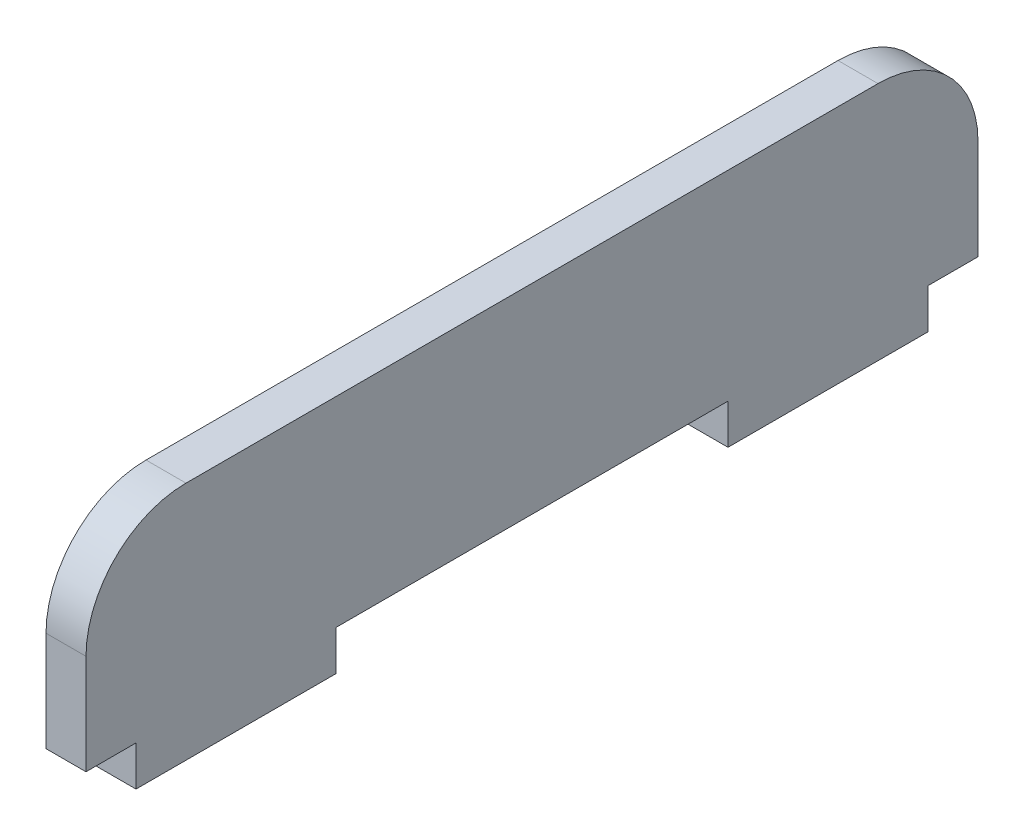
ISO-10303-21;
HEADER;
FILE_DESCRIPTION(('STEP AP214'),'2;1');
FILE_NAME('part.step','',(''),(''),'','','');
FILE_SCHEMA(('AUTOMOTIVE_DESIGN { 1 0 10303 214 1 1 1 1 }'));
ENDSEC;
DATA;
#1=APPLICATION_CONTEXT('core data for automotive mechanical design processes');
#2=APPLICATION_PROTOCOL_DEFINITION('international standard','automotive_design',2000,#1);
#3=PRODUCT_CONTEXT('',#1,'mechanical');
#4=PRODUCT('Part','Part','',(#3));
#5=PRODUCT_RELATED_PRODUCT_CATEGORY('part','',(#4));
#6=PRODUCT_DEFINITION_FORMATION('','',#4);
#7=PRODUCT_DEFINITION_CONTEXT('part definition',#1,'design');
#8=PRODUCT_DEFINITION('design','',#6,#7);
#9=PRODUCT_DEFINITION_SHAPE('','',#8);
#10=(LENGTH_UNIT() NAMED_UNIT(*) SI_UNIT(.MILLI.,.METRE.));
#11=(NAMED_UNIT(*) PLANE_ANGLE_UNIT() SI_UNIT($,.RADIAN.));
#12=(NAMED_UNIT(*) SI_UNIT($,.STERADIAN.) SOLID_ANGLE_UNIT());
#13=UNCERTAINTY_MEASURE_WITH_UNIT(LENGTH_MEASURE(1.E-05),#10,'distance_accuracy_value','');
#14=(GEOMETRIC_REPRESENTATION_CONTEXT(3) GLOBAL_UNCERTAINTY_ASSIGNED_CONTEXT((#13)) GLOBAL_UNIT_ASSIGNED_CONTEXT((#10,
#11,#12)) REPRESENTATION_CONTEXT('',''));
#15=CARTESIAN_POINT('',(0.,0.,0.));
#16=DIRECTION('',(0.,0.,1.));
#17=DIRECTION('',(1.,0.,0.));
#18=AXIS2_PLACEMENT_3D('',#15,#16,#17);
#19=CARTESIAN_POINT('',(164.,4.,-97.1));
#20=DIRECTION('',(0.,1.,0.));
#21=DIRECTION('',(0.,0.,1.));
#22=AXIS2_PLACEMENT_3D('',#19,#20,#21);
#23=PLANE('',#22);
#24=DIRECTION('',(0.,0.,-1.));
#25=VECTOR('',#24,1.);
#26=CARTESIAN_POINT('',(160.,4.,-97.1));
#27=LINE('',#26,#25);
#28=CARTESIAN_POINT('',(160.,4.,-92.1));
#29=VERTEX_POINT('',#28);
#30=CARTESIAN_POINT('',(160.,4.,-97.1));
#31=VERTEX_POINT('',#30);
#32=EDGE_CURVE('E162',#29,#31,#27,.T.);
#33=ORIENTED_EDGE('',*,*,#32,.T.);
#34=DIRECTION('',(-1.,0.,0.));
#35=VECTOR('',#34,1.);
#36=CARTESIAN_POINT('',(164.,4.,-97.1));
#37=LINE('',#36,#35);
#38=CARTESIAN_POINT('',(164.,4.,-97.1));
#39=VERTEX_POINT('',#38);
#40=EDGE_CURVE('E11',#39,#31,#37,.T.);
#41=ORIENTED_EDGE('',*,*,#40,.F.);
#42=DIRECTION('',(0.,0.,-1.));
#43=VECTOR('',#42,1.);
#44=CARTESIAN_POINT('',(164.,4.,-97.1));
#45=LINE('',#44,#43);
#46=CARTESIAN_POINT('',(164.,4.,-92.1));
#47=VERTEX_POINT('',#46);
#48=EDGE_CURVE('E189',#47,#39,#45,.T.);
#49=ORIENTED_EDGE('',*,*,#48,.F.);
#50=DIRECTION('',(-1.,0.,0.));
#51=VECTOR('',#50,1.);
#52=CARTESIAN_POINT('',(164.,4.,-92.1));
#53=LINE('',#52,#51);
#54=EDGE_CURVE('E158',#47,#29,#53,.T.);
#55=ORIENTED_EDGE('',*,*,#54,.T.);
#56=EDGE_LOOP('',(#33,#41,#49,#55));
#57=FACE_BOUND('',#56,.T.);
#58=ADVANCED_FACE('F30',(#57),#23,.F.);
#59=CARTESIAN_POINT('',(164.,14.,-97.1));
#60=DIRECTION('',(0.,0.,1.));
#61=DIRECTION('',(1.,0.,0.));
#62=AXIS2_PLACEMENT_3D('',#59,#60,#61);
#63=PLANE('',#62);
#64=DIRECTION('',(0.,1.,0.));
#65=VECTOR('',#64,1.);
#66=CARTESIAN_POINT('',(160.,14.,-97.1));
#67=LINE('',#66,#65);
#68=CARTESIAN_POINT('',(160.,14.,-97.1));
#69=VERTEX_POINT('',#68);
#70=EDGE_CURVE('E165',#31,#69,#67,.T.);
#71=ORIENTED_EDGE('',*,*,#70,.T.);
#72=DIRECTION('',(-1.,0.,0.));
#73=VECTOR('',#72,1.);
#74=CARTESIAN_POINT('',(164.,14.,-97.1));
#75=LINE('',#74,#73);
#76=CARTESIAN_POINT('',(164.,14.,-97.1));
#77=VERTEX_POINT('',#76);
#78=EDGE_CURVE('E38',#77,#69,#75,.T.);
#79=ORIENTED_EDGE('',*,*,#78,.F.);
#80=DIRECTION('',(0.,1.,0.));
#81=VECTOR('',#80,1.);
#82=CARTESIAN_POINT('',(164.,14.,-97.1));
#83=LINE('',#82,#81);
#84=EDGE_CURVE('E107',#39,#77,#83,.T.);
#85=ORIENTED_EDGE('',*,*,#84,.F.);
#86=ORIENTED_EDGE('',*,*,#40,.T.);
#87=EDGE_LOOP('',(#71,#79,#85,#86));
#88=FACE_BOUND('',#87,.T.);
#89=ADVANCED_FACE('F277',(#88),#63,.F.);
#90=CARTESIAN_POINT('',(164.,14.,-87.1));
#91=DIRECTION('',(-1.,0.,0.));
#92=DIRECTION('',(0.,0.,1.));
#93=AXIS2_PLACEMENT_3D('',#90,#91,#92);
#94=CYLINDRICAL_SURFACE('',#93,10.);
#95=CARTESIAN_POINT('',(160.,14.,-87.1));
#96=DIRECTION('',(1.,0.,0.));
#97=DIRECTION('',(0.,0.,-1.));
#98=AXIS2_PLACEMENT_3D('',#95,#96,#97);
#99=CIRCLE('',#98,10.);
#100=CARTESIAN_POINT('',(160.,24.,-87.1));
#101=VERTEX_POINT('',#100);
#102=EDGE_CURVE('E167',#69,#101,#99,.T.);
#103=ORIENTED_EDGE('',*,*,#102,.T.);
#104=DIRECTION('',(-1.,0.,0.));
#105=VECTOR('',#104,1.);
#106=CARTESIAN_POINT('',(164.,24.,-87.1));
#107=LINE('',#106,#105);
#108=CARTESIAN_POINT('',(164.,24.,-87.1));
#109=VERTEX_POINT('',#108);
#110=EDGE_CURVE('E214',#109,#101,#107,.T.);
#111=ORIENTED_EDGE('',*,*,#110,.F.);
#112=CARTESIAN_POINT('',(164.,14.,-87.1));
#113=DIRECTION('',(1.,0.,0.));
#114=DIRECTION('',(0.,0.,-1.));
#115=AXIS2_PLACEMENT_3D('',#112,#113,#114);
#116=CIRCLE('',#115,10.);
#117=EDGE_CURVE('E222',#77,#109,#116,.T.);
#118=ORIENTED_EDGE('',*,*,#117,.F.);
#119=ORIENTED_EDGE('',*,*,#78,.T.);
#120=EDGE_LOOP('',(#103,#111,#118,#119));
#121=FACE_BOUND('',#120,.T.);
#122=ADVANCED_FACE('F220',(#121),#94,.T.);
#123=CARTESIAN_POINT('',(164.,24.,-17.9));
#124=DIRECTION('',(0.,-1.,0.));
#125=DIRECTION('',(0.,0.,-1.));
#126=AXIS2_PLACEMENT_3D('',#123,#124,#125);
#127=PLANE('',#126);
#128=DIRECTION('',(0.,0.,1.));
#129=VECTOR('',#128,1.);
#130=CARTESIAN_POINT('',(160.,24.,-17.9));
#131=LINE('',#130,#129);
#132=CARTESIAN_POINT('',(160.,24.,-17.9));
#133=VERTEX_POINT('',#132);
#134=EDGE_CURVE('E169',#101,#133,#131,.T.);
#135=ORIENTED_EDGE('',*,*,#134,.T.);
#136=DIRECTION('',(-1.,0.,0.));
#137=VECTOR('',#136,1.);
#138=CARTESIAN_POINT('',(164.,24.,-17.9));
#139=LINE('',#138,#137);
#140=CARTESIAN_POINT('',(164.,24.,-17.9));
#141=VERTEX_POINT('',#140);
#142=EDGE_CURVE('E211',#141,#133,#139,.T.);
#143=ORIENTED_EDGE('',*,*,#142,.F.);
#144=DIRECTION('',(0.,0.,1.));
#145=VECTOR('',#144,1.);
#146=CARTESIAN_POINT('',(164.,24.,-17.9));
#147=LINE('',#146,#145);
#148=EDGE_CURVE('E240',#109,#141,#147,.T.);
#149=ORIENTED_EDGE('',*,*,#148,.F.);
#150=ORIENTED_EDGE('',*,*,#110,.T.);
#151=EDGE_LOOP('',(#135,#143,#149,#150));
#152=FACE_BOUND('',#151,.T.);
#153=ADVANCED_FACE('F231',(#152),#127,.F.);
#154=CARTESIAN_POINT('',(164.,14.,-17.9));
#155=DIRECTION('',(-1.,0.,0.));
#156=DIRECTION('',(0.,0.,1.));
#157=AXIS2_PLACEMENT_3D('',#154,#155,#156);
#158=CYLINDRICAL_SURFACE('',#157,10.);
#159=CARTESIAN_POINT('',(160.,14.,-17.9));
#160=DIRECTION('',(1.,0.,0.));
#161=DIRECTION('',(0.,0.,1.));
#162=AXIS2_PLACEMENT_3D('',#159,#160,#161);
#163=CIRCLE('',#162,10.);
#164=CARTESIAN_POINT('',(160.,14.,-7.9));
#165=VERTEX_POINT('',#164);
#166=EDGE_CURVE('E171',#133,#165,#163,.T.);
#167=ORIENTED_EDGE('',*,*,#166,.T.);
#168=DIRECTION('',(-1.,0.,0.));
#169=VECTOR('',#168,1.);
#170=CARTESIAN_POINT('',(164.,14.,-7.9));
#171=LINE('',#170,#169);
#172=CARTESIAN_POINT('',(164.,14.,-7.9));
#173=VERTEX_POINT('',#172);
#174=EDGE_CURVE('E208',#173,#165,#171,.T.);
#175=ORIENTED_EDGE('',*,*,#174,.F.);
#176=CARTESIAN_POINT('',(164.,14.,-17.9));
#177=DIRECTION('',(1.,0.,0.));
#178=DIRECTION('',(0.,0.,1.));
#179=AXIS2_PLACEMENT_3D('',#176,#177,#178);
#180=CIRCLE('',#179,10.);
#181=EDGE_CURVE('E237',#141,#173,#180,.T.);
#182=ORIENTED_EDGE('',*,*,#181,.F.);
#183=ORIENTED_EDGE('',*,*,#142,.T.);
#184=EDGE_LOOP('',(#167,#175,#182,#183));
#185=FACE_BOUND('',#184,.T.);
#186=ADVANCED_FACE('F235',(#185),#158,.T.);
#187=CARTESIAN_POINT('',(164.,4.,-7.9));
#188=DIRECTION('',(0.,0.,-1.));
#189=DIRECTION('',(-1.,0.,0.));
#190=AXIS2_PLACEMENT_3D('',#187,#188,#189);
#191=PLANE('',#190);
#192=DIRECTION('',(0.,-1.,0.));
#193=VECTOR('',#192,1.);
#194=CARTESIAN_POINT('',(160.,4.,-7.9));
#195=LINE('',#194,#193);
#196=CARTESIAN_POINT('',(160.,4.,-7.9));
#197=VERTEX_POINT('',#196);
#198=EDGE_CURVE('E173',#165,#197,#195,.T.);
#199=ORIENTED_EDGE('',*,*,#198,.T.);
#200=DIRECTION('',(-1.,0.,0.));
#201=VECTOR('',#200,1.);
#202=CARTESIAN_POINT('',(164.,4.,-7.9));
#203=LINE('',#202,#201);
#204=CARTESIAN_POINT('',(164.,4.,-7.9));
#205=VERTEX_POINT('',#204);
#206=EDGE_CURVE('E205',#205,#197,#203,.T.);
#207=ORIENTED_EDGE('',*,*,#206,.F.);
#208=DIRECTION('',(0.,-1.,0.));
#209=VECTOR('',#208,1.);
#210=CARTESIAN_POINT('',(164.,4.,-7.9));
#211=LINE('',#210,#209);
#212=EDGE_CURVE('E239',#173,#205,#211,.T.);
#213=ORIENTED_EDGE('',*,*,#212,.F.);
#214=ORIENTED_EDGE('',*,*,#174,.T.);
#215=EDGE_LOOP('',(#199,#207,#213,#214));
#216=FACE_BOUND('',#215,.T.);
#217=ADVANCED_FACE('F290',(#216),#191,.F.);
#218=CARTESIAN_POINT('',(164.,4.,-12.9));
#219=DIRECTION('',(0.,1.,0.));
#220=DIRECTION('',(0.,0.,1.));
#221=AXIS2_PLACEMENT_3D('',#218,#219,#220);
#222=PLANE('',#221);
#223=DIRECTION('',(0.,0.,-1.));
#224=VECTOR('',#223,1.);
#225=CARTESIAN_POINT('',(160.,4.,-12.9));
#226=LINE('',#225,#224);
#227=CARTESIAN_POINT('',(160.,4.,-12.9));
#228=VERTEX_POINT('',#227);
#229=EDGE_CURVE('E175',#197,#228,#226,.T.);
#230=ORIENTED_EDGE('',*,*,#229,.T.);
#231=DIRECTION('',(-1.,0.,0.));
#232=VECTOR('',#231,1.);
#233=CARTESIAN_POINT('',(164.,4.,-12.9));
#234=LINE('',#233,#232);
#235=CARTESIAN_POINT('',(164.,4.,-12.9));
#236=VERTEX_POINT('',#235);
#237=EDGE_CURVE('E202',#236,#228,#234,.T.);
#238=ORIENTED_EDGE('',*,*,#237,.F.);
#239=DIRECTION('',(0.,0.,-1.));
#240=VECTOR('',#239,1.);
#241=CARTESIAN_POINT('',(164.,4.,-12.9));
#242=LINE('',#241,#240);
#243=EDGE_CURVE('E242',#205,#236,#242,.T.);
#244=ORIENTED_EDGE('',*,*,#243,.F.);
#245=ORIENTED_EDGE('',*,*,#206,.T.);
#246=EDGE_LOOP('',(#230,#238,#244,#245));
#247=FACE_BOUND('',#246,.T.);
#248=ADVANCED_FACE('F293',(#247),#222,.F.);
#249=CARTESIAN_POINT('',(164.,0.,-12.9));
#250=DIRECTION('',(0.,0.,-1.));
#251=DIRECTION('',(-1.,0.,0.));
#252=AXIS2_PLACEMENT_3D('',#249,#250,#251);
#253=PLANE('',#252);
#254=DIRECTION('',(0.,-1.,0.));
#255=VECTOR('',#254,1.);
#256=CARTESIAN_POINT('',(160.,0.,-12.9));
#257=LINE('',#256,#255);
#258=CARTESIAN_POINT('',(160.,0.,-12.9));
#259=VERTEX_POINT('',#258);
#260=EDGE_CURVE('E177',#228,#259,#257,.T.);
#261=ORIENTED_EDGE('',*,*,#260,.T.);
#262=DIRECTION('',(-1.,0.,0.));
#263=VECTOR('',#262,1.);
#264=CARTESIAN_POINT('',(164.,0.,-12.9));
#265=LINE('',#264,#263);
#266=CARTESIAN_POINT('',(164.,0.,-12.9));
#267=VERTEX_POINT('',#266);
#268=EDGE_CURVE('E199',#267,#259,#265,.T.);
#269=ORIENTED_EDGE('',*,*,#268,.F.);
#270=DIRECTION('',(0.,-1.,0.));
#271=VECTOR('',#270,1.);
#272=CARTESIAN_POINT('',(164.,0.,-12.9));
#273=LINE('',#272,#271);
#274=EDGE_CURVE('E248',#236,#267,#273,.T.);
#275=ORIENTED_EDGE('',*,*,#274,.F.);
#276=ORIENTED_EDGE('',*,*,#237,.T.);
#277=EDGE_LOOP('',(#261,#269,#275,#276));
#278=FACE_BOUND('',#277,.T.);
#279=ADVANCED_FACE('F297',(#278),#253,.F.);
#280=CARTESIAN_POINT('',(164.,0.,-32.9));
#281=DIRECTION('',(0.,1.,0.));
#282=DIRECTION('',(0.,0.,1.));
#283=AXIS2_PLACEMENT_3D('',#280,#281,#282);
#284=PLANE('',#283);
#285=DIRECTION('',(0.,0.,-1.));
#286=VECTOR('',#285,1.);
#287=CARTESIAN_POINT('',(160.,0.,-32.9));
#288=LINE('',#287,#286);
#289=CARTESIAN_POINT('',(160.,0.,-32.9));
#290=VERTEX_POINT('',#289);
#291=EDGE_CURVE('E180',#259,#290,#288,.T.);
#292=ORIENTED_EDGE('',*,*,#291,.T.);
#293=DIRECTION('',(-1.,0.,0.));
#294=VECTOR('',#293,1.);
#295=CARTESIAN_POINT('',(164.,0.,-32.9));
#296=LINE('',#295,#294);
#297=CARTESIAN_POINT('',(164.,0.,-32.9));
#298=VERTEX_POINT('',#297);
#299=EDGE_CURVE('E196',#298,#290,#296,.T.);
#300=ORIENTED_EDGE('',*,*,#299,.F.);
#301=DIRECTION('',(0.,0.,-1.));
#302=VECTOR('',#301,1.);
#303=CARTESIAN_POINT('',(164.,0.,-13.55));
#304=LINE('',#303,#302);
#305=EDGE_CURVE('E250',#267,#298,#304,.T.);
#306=ORIENTED_EDGE('',*,*,#305,.F.);
#307=ORIENTED_EDGE('',*,*,#268,.T.);
#308=EDGE_LOOP('',(#292,#300,#306,#307));
#309=FACE_BOUND('',#308,.T.);
#310=ADVANCED_FACE('F301',(#309),#284,.F.);
#311=CARTESIAN_POINT('',(164.,4.,-32.9));
#312=DIRECTION('',(0.,0.,1.));
#313=DIRECTION('',(0.,-1.,0.));
#314=AXIS2_PLACEMENT_3D('',#311,#312,#313);
#315=PLANE('',#314);
#316=DIRECTION('',(0.,1.,0.));
#317=VECTOR('',#316,1.);
#318=CARTESIAN_POINT('',(160.,4.,-32.9));
#319=LINE('',#318,#317);
#320=CARTESIAN_POINT('',(160.,4.,-32.9));
#321=VERTEX_POINT('',#320);
#322=EDGE_CURVE('E182',#290,#321,#319,.T.);
#323=ORIENTED_EDGE('',*,*,#322,.T.);
#324=DIRECTION('',(-1.,0.,0.));
#325=VECTOR('',#324,1.);
#326=CARTESIAN_POINT('',(164.,4.,-32.9));
#327=LINE('',#326,#325);
#328=CARTESIAN_POINT('',(164.,4.,-32.9));
#329=VERTEX_POINT('',#328);
#330=EDGE_CURVE('E193',#329,#321,#327,.T.);
#331=ORIENTED_EDGE('',*,*,#330,.F.);
#332=DIRECTION('',(0.,1.,0.));
#333=VECTOR('',#332,1.);
#334=CARTESIAN_POINT('',(164.,4.,-32.9));
#335=LINE('',#334,#333);
#336=EDGE_CURVE('E252',#298,#329,#335,.T.);
#337=ORIENTED_EDGE('',*,*,#336,.F.);
#338=ORIENTED_EDGE('',*,*,#299,.T.);
#339=EDGE_LOOP('',(#323,#331,#337,#338));
#340=FACE_BOUND('',#339,.T.);
#341=ADVANCED_FACE('F258',(#340),#315,.F.);
#342=CARTESIAN_POINT('',(164.,4.,-72.1));
#343=DIRECTION('',(0.,1.,0.));
#344=DIRECTION('',(0.,0.,1.));
#345=AXIS2_PLACEMENT_3D('',#342,#343,#344);
#346=PLANE('',#345);
#347=DIRECTION('',(0.,0.,-1.));
#348=VECTOR('',#347,1.);
#349=CARTESIAN_POINT('',(160.,4.,-72.1));
#350=LINE('',#349,#348);
#351=CARTESIAN_POINT('',(160.,4.,-72.1));
#352=VERTEX_POINT('',#351);
#353=EDGE_CURVE('E184',#321,#352,#350,.T.);
#354=ORIENTED_EDGE('',*,*,#353,.T.);
#355=DIRECTION('',(-1.,0.,0.));
#356=VECTOR('',#355,1.);
#357=CARTESIAN_POINT('',(164.,4.,-72.1));
#358=LINE('',#357,#356);
#359=CARTESIAN_POINT('',(164.,4.,-72.1));
#360=VERTEX_POINT('',#359);
#361=EDGE_CURVE('E153',#360,#352,#358,.T.);
#362=ORIENTED_EDGE('',*,*,#361,.F.);
#363=DIRECTION('',(0.,0.,-1.));
#364=VECTOR('',#363,1.);
#365=CARTESIAN_POINT('',(164.,4.,-72.1));
#366=LINE('',#365,#364);
#367=EDGE_CURVE('E144',#329,#360,#366,.T.);
#368=ORIENTED_EDGE('',*,*,#367,.F.);
#369=ORIENTED_EDGE('',*,*,#330,.T.);
#370=EDGE_LOOP('',(#354,#362,#368,#369));
#371=FACE_BOUND('',#370,.T.);
#372=ADVANCED_FACE('F262',(#371),#346,.F.);
#373=CARTESIAN_POINT('',(164.,0.,-72.1));
#374=DIRECTION('',(0.,0.,-1.));
#375=DIRECTION('',(-1.,0.,0.));
#376=AXIS2_PLACEMENT_3D('',#373,#374,#375);
#377=PLANE('',#376);
#378=DIRECTION('',(0.,-1.,0.));
#379=VECTOR('',#378,1.);
#380=CARTESIAN_POINT('',(160.,0.,-72.1));
#381=LINE('',#380,#379);
#382=CARTESIAN_POINT('',(160.,0.,-72.1));
#383=VERTEX_POINT('',#382);
#384=EDGE_CURVE('E152',#352,#383,#381,.T.);
#385=ORIENTED_EDGE('',*,*,#384,.T.);
#386=DIRECTION('',(-1.,0.,0.));
#387=VECTOR('',#386,1.);
#388=CARTESIAN_POINT('',(164.,0.,-72.1));
#389=LINE('',#388,#387);
#390=CARTESIAN_POINT('',(164.,0.,-72.1));
#391=VERTEX_POINT('',#390);
#392=EDGE_CURVE('E149',#391,#383,#389,.T.);
#393=ORIENTED_EDGE('',*,*,#392,.F.);
#394=DIRECTION('',(0.,-1.,0.));
#395=VECTOR('',#394,1.);
#396=CARTESIAN_POINT('',(164.,0.,-72.1));
#397=LINE('',#396,#395);
#398=EDGE_CURVE('E138',#360,#391,#397,.T.);
#399=ORIENTED_EDGE('',*,*,#398,.F.);
#400=ORIENTED_EDGE('',*,*,#361,.T.);
#401=EDGE_LOOP('',(#385,#393,#399,#400));
#402=FACE_BOUND('',#401,.T.);
#403=ADVANCED_FACE('F150',(#402),#377,.F.);
#404=CARTESIAN_POINT('',(164.,0.,-92.1));
#405=DIRECTION('',(0.,1.,0.));
#406=DIRECTION('',(0.,0.,1.));
#407=AXIS2_PLACEMENT_3D('',#404,#405,#406);
#408=PLANE('',#407);
#409=DIRECTION('',(0.,0.,-1.));
#410=VECTOR('',#409,1.);
#411=CARTESIAN_POINT('',(160.,0.,-92.1));
#412=LINE('',#411,#410);
#413=CARTESIAN_POINT('',(160.,0.,-92.1));
#414=VERTEX_POINT('',#413);
#415=EDGE_CURVE('E93',#383,#414,#412,.T.);
#416=ORIENTED_EDGE('',*,*,#415,.T.);
#417=DIRECTION('',(-1.,0.,0.));
#418=VECTOR('',#417,1.);
#419=CARTESIAN_POINT('',(164.,0.,-92.1));
#420=LINE('',#419,#418);
#421=CARTESIAN_POINT('',(164.,0.,-92.1));
#422=VERTEX_POINT('',#421);
#423=EDGE_CURVE('E154',#422,#414,#420,.T.);
#424=ORIENTED_EDGE('',*,*,#423,.F.);
#425=DIRECTION('',(0.,0.,-1.));
#426=VECTOR('',#425,1.);
#427=CARTESIAN_POINT('',(164.,0.,-92.1));
#428=LINE('',#427,#426);
#429=EDGE_CURVE('E142',#391,#422,#428,.T.);
#430=ORIENTED_EDGE('',*,*,#429,.F.);
#431=ORIENTED_EDGE('',*,*,#392,.T.);
#432=EDGE_LOOP('',(#416,#424,#430,#431));
#433=FACE_BOUND('',#432,.T.);
#434=ADVANCED_FACE('F156',(#433),#408,.F.);
#435=CARTESIAN_POINT('',(164.,4.,-92.1));
#436=DIRECTION('',(0.,0.,1.));
#437=DIRECTION('',(1.,0.,0.));
#438=AXIS2_PLACEMENT_3D('',#435,#436,#437);
#439=PLANE('',#438);
#440=DIRECTION('',(0.,1.,0.));
#441=VECTOR('',#440,1.);
#442=CARTESIAN_POINT('',(160.,4.,-92.1));
#443=LINE('',#442,#441);
#444=EDGE_CURVE('E99',#414,#29,#443,.T.);
#445=ORIENTED_EDGE('',*,*,#444,.T.);
#446=ORIENTED_EDGE('',*,*,#54,.F.);
#447=DIRECTION('',(0.,1.,0.));
#448=VECTOR('',#447,1.);
#449=CARTESIAN_POINT('',(164.,4.,-92.1));
#450=LINE('',#449,#448);
#451=EDGE_CURVE('E46',#422,#47,#450,.T.);
#452=ORIENTED_EDGE('',*,*,#451,.F.);
#453=ORIENTED_EDGE('',*,*,#423,.T.);
#454=EDGE_LOOP('',(#445,#446,#452,#453));
#455=FACE_BOUND('',#454,.T.);
#456=ADVANCED_FACE('F266',(#455),#439,.F.);
#457=CARTESIAN_POINT('',(164.,14.,-17.9));
#458=DIRECTION('',(-1.,0.,0.));
#459=DIRECTION('',(0.,0.,1.));
#460=AXIS2_PLACEMENT_3D('',#457,#458,#459);
#461=PLANE('',#460);
#462=ORIENTED_EDGE('',*,*,#48,.T.);
#463=ORIENTED_EDGE('',*,*,#84,.T.);
#464=ORIENTED_EDGE('',*,*,#117,.T.);
#465=ORIENTED_EDGE('',*,*,#148,.T.);
#466=ORIENTED_EDGE('',*,*,#181,.T.);
#467=ORIENTED_EDGE('',*,*,#212,.T.);
#468=ORIENTED_EDGE('',*,*,#243,.T.);
#469=ORIENTED_EDGE('',*,*,#274,.T.);
#470=ORIENTED_EDGE('',*,*,#305,.T.);
#471=ORIENTED_EDGE('',*,*,#336,.T.);
#472=ORIENTED_EDGE('',*,*,#367,.T.);
#473=ORIENTED_EDGE('',*,*,#398,.T.);
#474=ORIENTED_EDGE('',*,*,#429,.T.);
#475=ORIENTED_EDGE('',*,*,#451,.T.);
#476=EDGE_LOOP('',(#462,#463,#464,#465,#466,#467,#468,#469,#470,#471,#472,#473,#474,#475));
#477=FACE_BOUND('',#476,.T.);
#478=ADVANCED_FACE('F140',(#477),#461,.F.);
#479=CARTESIAN_POINT('',(160.,14.,-17.9));
#480=DIRECTION('',(-1.,0.,0.));
#481=DIRECTION('',(0.,0.,1.));
#482=AXIS2_PLACEMENT_3D('',#479,#480,#481);
#483=PLANE('',#482);
#484=ORIENTED_EDGE('',*,*,#32,.F.);
#485=ORIENTED_EDGE('',*,*,#444,.F.);
#486=ORIENTED_EDGE('',*,*,#415,.F.);
#487=ORIENTED_EDGE('',*,*,#384,.F.);
#488=ORIENTED_EDGE('',*,*,#353,.F.);
#489=ORIENTED_EDGE('',*,*,#322,.F.);
#490=ORIENTED_EDGE('',*,*,#291,.F.);
#491=ORIENTED_EDGE('',*,*,#260,.F.);
#492=ORIENTED_EDGE('',*,*,#229,.F.);
#493=ORIENTED_EDGE('',*,*,#198,.F.);
#494=ORIENTED_EDGE('',*,*,#166,.F.);
#495=ORIENTED_EDGE('',*,*,#134,.F.);
#496=ORIENTED_EDGE('',*,*,#102,.F.);
#497=ORIENTED_EDGE('',*,*,#70,.F.);
#498=EDGE_LOOP('',(#484,#485,#486,#487,#488,#489,#490,#491,#492,#493,#494,#495,#496,#497));
#499=FACE_BOUND('',#498,.T.);
#500=ADVANCED_FACE('F226',(#499),#483,.T.);
#501=CLOSED_SHELL('',(#58,#89,#122,#153,#186,#217,#248,#279,#310,#341,#372,#403,#434,#456,#478,#500));
#502=MANIFOLD_SOLID_BREP('B2',#501);
#503=ADVANCED_BREP_SHAPE_REPRESENTATION('',(#18,#502),#14);
#504=SHAPE_DEFINITION_REPRESENTATION(#9,#503);
ENDSEC;
END-ISO-10303-21;
